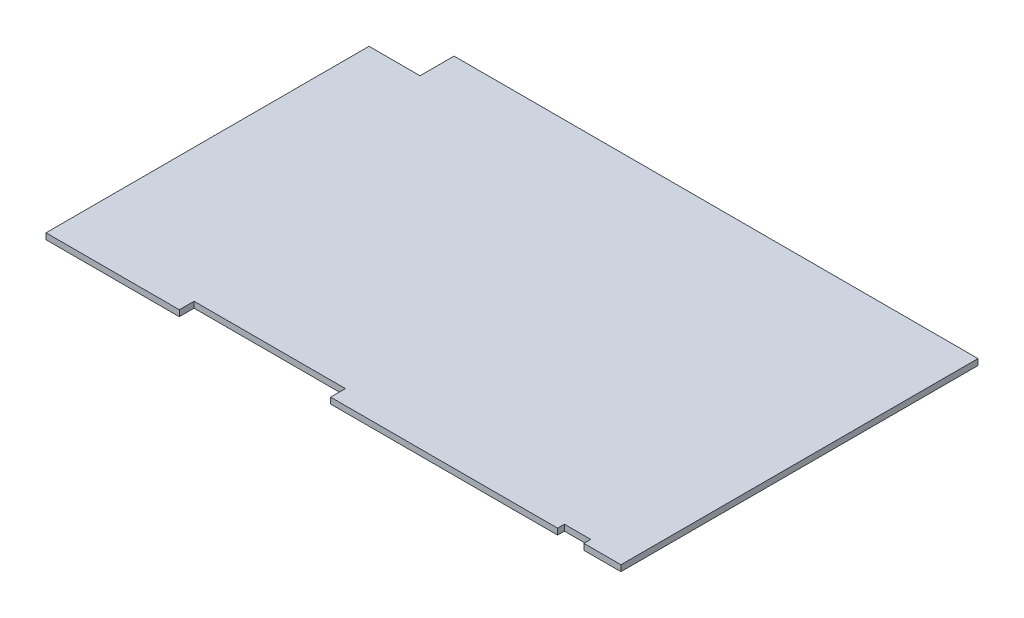
ISO-10303-21;
HEADER;
FILE_DESCRIPTION(('STEP AP214'),'2;1');
FILE_NAME('part.step','',(''),(''),'','','');
FILE_SCHEMA(('AUTOMOTIVE_DESIGN { 1 0 10303 214 1 1 1 1 }'));
ENDSEC;
DATA;
#1=APPLICATION_CONTEXT('core data for automotive mechanical design processes');
#2=APPLICATION_PROTOCOL_DEFINITION('international standard','automotive_design',2000,#1);
#3=PRODUCT_CONTEXT('',#1,'mechanical');
#4=PRODUCT('Part','Part','',(#3));
#5=PRODUCT_RELATED_PRODUCT_CATEGORY('part','',(#4));
#6=PRODUCT_DEFINITION_FORMATION('','',#4);
#7=PRODUCT_DEFINITION_CONTEXT('part definition',#1,'design');
#8=PRODUCT_DEFINITION('design','',#6,#7);
#9=PRODUCT_DEFINITION_SHAPE('','',#8);
#10=(LENGTH_UNIT() NAMED_UNIT(*) SI_UNIT(.MILLI.,.METRE.));
#11=(NAMED_UNIT(*) PLANE_ANGLE_UNIT() SI_UNIT($,.RADIAN.));
#12=(NAMED_UNIT(*) SI_UNIT($,.STERADIAN.) SOLID_ANGLE_UNIT());
#13=UNCERTAINTY_MEASURE_WITH_UNIT(LENGTH_MEASURE(1.E-05),#10,'distance_accuracy_value','');
#14=(GEOMETRIC_REPRESENTATION_CONTEXT(3) GLOBAL_UNCERTAINTY_ASSIGNED_CONTEXT((#13)) GLOBAL_UNIT_ASSIGNED_CONTEXT((#10,
#11,#12)) REPRESENTATION_CONTEXT('',''));
#15=CARTESIAN_POINT('',(0.,0.,0.));
#16=DIRECTION('',(0.,0.,1.));
#17=DIRECTION('',(1.,0.,0.));
#18=AXIS2_PLACEMENT_3D('',#15,#16,#17);
#19=CARTESIAN_POINT('',(-75.9999999996955,1.6,47.19999999981));
#20=DIRECTION('',(0.,0.,-1.));
#21=DIRECTION('',(-1.,0.,0.));
#22=AXIS2_PLACEMENT_3D('',#19,#20,#21);
#23=PLANE('',#22);
#24=DIRECTION('',(1.,0.,0.));
#25=VECTOR('',#24,1.);
#26=CARTESIAN_POINT('',(-75.9999999996955,0.,47.19999999981));
#27=LINE('',#26,#25);
#28=CARTESIAN_POINT('',(-75.9999999996955,0.,47.19999999981));
#29=VERTEX_POINT('',#28);
#30=CARTESIAN_POINT('',(-40.7499992098645,0.,47.19999999981));
#31=VERTEX_POINT('',#30);
#32=EDGE_CURVE('E165',#29,#31,#27,.T.);
#33=ORIENTED_EDGE('',*,*,#32,.T.);
#34=DIRECTION('',(0.,-1.,0.));
#35=VECTOR('',#34,1.);
#36=CARTESIAN_POINT('',(-40.7499992098645,1.6,47.19999999981));
#37=LINE('',#36,#35);
#38=CARTESIAN_POINT('',(-40.7499992098645,1.6,47.19999999981));
#39=VERTEX_POINT('',#38);
#40=EDGE_CURVE('E11',#39,#31,#37,.T.);
#41=ORIENTED_EDGE('',*,*,#40,.F.);
#42=DIRECTION('',(1.,0.,0.));
#43=VECTOR('',#42,1.);
#44=CARTESIAN_POINT('',(-75.9999999996955,1.6,47.19999999981));
#45=LINE('',#44,#43);
#46=CARTESIAN_POINT('',(-75.9999999996955,1.6,47.19999999981));
#47=VERTEX_POINT('',#46);
#48=EDGE_CURVE('E191',#47,#39,#45,.T.);
#49=ORIENTED_EDGE('',*,*,#48,.F.);
#50=DIRECTION('',(0.,-1.,0.));
#51=VECTOR('',#50,1.);
#52=CARTESIAN_POINT('',(-75.9999999996955,1.6,47.19999999981));
#53=LINE('',#52,#51);
#54=EDGE_CURVE('E161',#47,#29,#53,.T.);
#55=ORIENTED_EDGE('',*,*,#54,.T.);
#56=EDGE_LOOP('',(#33,#41,#49,#55));
#57=FACE_BOUND('',#56,.T.);
#58=ADVANCED_FACE('F33',(#57),#23,.F.);
#59=CARTESIAN_POINT('',(-40.7499992098645,1.6,47.19999999981));
#60=DIRECTION('',(-1.,0.,0.));
#61=DIRECTION('',(0.,0.,1.));
#62=AXIS2_PLACEMENT_3D('',#59,#60,#61);
#63=PLANE('',#62);
#64=DIRECTION('',(0.,0.,-1.));
#65=VECTOR('',#64,1.);
#66=CARTESIAN_POINT('',(-40.7499992098645,0.,47.19999999981));
#67=LINE('',#66,#65);
#68=CARTESIAN_POINT('',(-40.7499992098645,0.,43.299999967931));
#69=VERTEX_POINT('',#68);
#70=EDGE_CURVE('E168',#31,#69,#67,.T.);
#71=ORIENTED_EDGE('',*,*,#70,.T.);
#72=DIRECTION('',(0.,-1.,0.));
#73=VECTOR('',#72,1.);
#74=CARTESIAN_POINT('',(-40.7499992098645,1.6,43.299999967931));
#75=LINE('',#74,#73);
#76=CARTESIAN_POINT('',(-40.7499992098645,1.6,43.299999967931));
#77=VERTEX_POINT('',#76);
#78=EDGE_CURVE('E41',#77,#69,#75,.T.);
#79=ORIENTED_EDGE('',*,*,#78,.F.);
#80=DIRECTION('',(0.,0.,-1.));
#81=VECTOR('',#80,1.);
#82=CARTESIAN_POINT('',(-40.7499992098645,1.6,47.19999999981));
#83=LINE('',#82,#81);
#84=EDGE_CURVE('E110',#39,#77,#83,.T.);
#85=ORIENTED_EDGE('',*,*,#84,.F.);
#86=ORIENTED_EDGE('',*,*,#40,.T.);
#87=EDGE_LOOP('',(#71,#79,#85,#86));
#88=FACE_BOUND('',#87,.T.);
#89=ADVANCED_FACE('F279',(#88),#63,.F.);
#90=CARTESIAN_POINT('',(-40.7499992098645,1.6,43.299999967931));
#91=DIRECTION('',(0.,0.,-1.));
#92=DIRECTION('',(-1.,0.,0.));
#93=AXIS2_PLACEMENT_3D('',#90,#91,#92);
#94=PLANE('',#93);
#95=DIRECTION('',(1.,0.,0.));
#96=VECTOR('',#95,1.);
#97=CARTESIAN_POINT('',(-40.7499992098645,0.,43.299999967931));
#98=LINE('',#97,#96);
#99=CARTESIAN_POINT('',(-0.74999920986453,0.,43.299999967931));
#100=VERTEX_POINT('',#99);
#101=EDGE_CURVE('E170',#69,#100,#98,.T.);
#102=ORIENTED_EDGE('',*,*,#101,.T.);
#103=DIRECTION('',(0.,-1.,0.));
#104=VECTOR('',#103,1.);
#105=CARTESIAN_POINT('',(-0.74999920986453,1.6,43.299999967931));
#106=LINE('',#105,#104);
#107=CARTESIAN_POINT('',(-0.74999920986453,1.6,43.299999967931));
#108=VERTEX_POINT('',#107);
#109=EDGE_CURVE('E216',#108,#100,#106,.T.);
#110=ORIENTED_EDGE('',*,*,#109,.F.);
#111=DIRECTION('',(1.,0.,0.));
#112=VECTOR('',#111,1.);
#113=CARTESIAN_POINT('',(-40.7499992098645,1.6,43.299999967931));
#114=LINE('',#113,#112);
#115=EDGE_CURVE('E224',#77,#108,#114,.T.);
#116=ORIENTED_EDGE('',*,*,#115,.F.);
#117=ORIENTED_EDGE('',*,*,#78,.T.);
#118=EDGE_LOOP('',(#102,#110,#116,#117));
#119=FACE_BOUND('',#118,.T.);
#120=ADVANCED_FACE('F222',(#119),#94,.F.);
#121=CARTESIAN_POINT('',(-0.74999920986453,1.6,43.299999967931));
#122=DIRECTION('',(1.,0.,0.));
#123=DIRECTION('',(0.,0.,-1.));
#124=AXIS2_PLACEMENT_3D('',#121,#122,#123);
#125=PLANE('',#124);
#126=DIRECTION('',(0.,0.,1.));
#127=VECTOR('',#126,1.);
#128=CARTESIAN_POINT('',(-0.74999920986453,0.,43.299999967931));
#129=LINE('',#128,#127);
#130=CARTESIAN_POINT('',(-0.749999209864532,0.,47.19999999981));
#131=VERTEX_POINT('',#130);
#132=EDGE_CURVE('E172',#100,#131,#129,.T.);
#133=ORIENTED_EDGE('',*,*,#132,.T.);
#134=DIRECTION('',(0.,-1.,0.));
#135=VECTOR('',#134,1.);
#136=CARTESIAN_POINT('',(-0.749999209864532,1.6,47.19999999981));
#137=LINE('',#136,#135);
#138=CARTESIAN_POINT('',(-0.749999209864532,1.6,47.19999999981));
#139=VERTEX_POINT('',#138);
#140=EDGE_CURVE('E213',#139,#131,#137,.T.);
#141=ORIENTED_EDGE('',*,*,#140,.F.);
#142=DIRECTION('',(0.,0.,1.));
#143=VECTOR('',#142,1.);
#144=CARTESIAN_POINT('',(-0.74999920986453,1.6,43.299999967931));
#145=LINE('',#144,#143);
#146=EDGE_CURVE('E242',#108,#139,#145,.T.);
#147=ORIENTED_EDGE('',*,*,#146,.F.);
#148=ORIENTED_EDGE('',*,*,#109,.T.);
#149=EDGE_LOOP('',(#133,#141,#147,#148));
#150=FACE_BOUND('',#149,.T.);
#151=ADVANCED_FACE('F233',(#150),#125,.F.);
#152=CARTESIAN_POINT('',(-0.749999209864532,1.6,47.19999999981));
#153=DIRECTION('',(0.,0.,-1.));
#154=DIRECTION('',(-1.,0.,0.));
#155=AXIS2_PLACEMENT_3D('',#152,#153,#154);
#156=PLANE('',#155);
#157=DIRECTION('',(1.,0.,0.));
#158=VECTOR('',#157,1.);
#159=CARTESIAN_POINT('',(-0.749999209864532,0.,47.19999999981));
#160=LINE('',#159,#158);
#161=CARTESIAN_POINT('',(59.2500007901355,0.,47.19999999981));
#162=VERTEX_POINT('',#161);
#163=EDGE_CURVE('E174',#131,#162,#160,.T.);
#164=ORIENTED_EDGE('',*,*,#163,.T.);
#165=DIRECTION('',(0.,-1.,0.));
#166=VECTOR('',#165,1.);
#167=CARTESIAN_POINT('',(59.2500007901355,1.6,47.19999999981));
#168=LINE('',#167,#166);
#169=CARTESIAN_POINT('',(59.2500007901355,1.6,47.19999999981));
#170=VERTEX_POINT('',#169);
#171=EDGE_CURVE('E210',#170,#162,#168,.T.);
#172=ORIENTED_EDGE('',*,*,#171,.F.);
#173=DIRECTION('',(1.,0.,0.));
#174=VECTOR('',#173,1.);
#175=CARTESIAN_POINT('',(-0.749999209864532,1.6,47.19999999981));
#176=LINE('',#175,#174);
#177=EDGE_CURVE('E239',#139,#170,#176,.T.);
#178=ORIENTED_EDGE('',*,*,#177,.F.);
#179=ORIENTED_EDGE('',*,*,#140,.T.);
#180=EDGE_LOOP('',(#164,#172,#178,#179));
#181=FACE_BOUND('',#180,.T.);
#182=ADVANCED_FACE('F237',(#181),#156,.F.);
#183=CARTESIAN_POINT('',(59.2500007901355,1.6,47.19999999981));
#184=DIRECTION('',(-1.,0.,0.));
#185=DIRECTION('',(0.,0.,1.));
#186=AXIS2_PLACEMENT_3D('',#183,#184,#185);
#187=PLANE('',#186);
#188=DIRECTION('',(0.,0.,-1.));
#189=VECTOR('',#188,1.);
#190=CARTESIAN_POINT('',(59.2500007901355,0.,47.19999999981));
#191=LINE('',#190,#189);
#192=CARTESIAN_POINT('',(59.2500007901355,0.,45.38999999981));
#193=VERTEX_POINT('',#192);
#194=EDGE_CURVE('E176',#162,#193,#191,.T.);
#195=ORIENTED_EDGE('',*,*,#194,.T.);
#196=DIRECTION('',(0.,-1.,0.));
#197=VECTOR('',#196,1.);
#198=CARTESIAN_POINT('',(59.2500007901355,1.6,45.38999999981));
#199=LINE('',#198,#197);
#200=CARTESIAN_POINT('',(59.2500007901355,1.6,45.38999999981));
#201=VERTEX_POINT('',#200);
#202=EDGE_CURVE('E207',#201,#193,#199,.T.);
#203=ORIENTED_EDGE('',*,*,#202,.F.);
#204=DIRECTION('',(0.,0.,-1.));
#205=VECTOR('',#204,1.);
#206=CARTESIAN_POINT('',(59.2500007901355,1.6,47.19999999981));
#207=LINE('',#206,#205);
#208=EDGE_CURVE('E241',#170,#201,#207,.T.);
#209=ORIENTED_EDGE('',*,*,#208,.F.);
#210=ORIENTED_EDGE('',*,*,#171,.T.);
#211=EDGE_LOOP('',(#195,#203,#209,#210));
#212=FACE_BOUND('',#211,.T.);
#213=ADVANCED_FACE('F292',(#212),#187,.F.);
#214=CARTESIAN_POINT('',(59.2500007901355,1.6,45.38999999981));
#215=DIRECTION('',(0.,0.,-1.));
#216=DIRECTION('',(-1.,0.,0.));
#217=AXIS2_PLACEMENT_3D('',#214,#215,#216);
#218=PLANE('',#217);
#219=DIRECTION('',(1.,0.,0.));
#220=VECTOR('',#219,1.);
#221=CARTESIAN_POINT('',(59.2500007901355,0.,45.38999999981));
#222=LINE('',#221,#220);
#223=CARTESIAN_POINT('',(66.1950000003045,0.,45.38999999981));
#224=VERTEX_POINT('',#223);
#225=EDGE_CURVE('E178',#193,#224,#222,.T.);
#226=ORIENTED_EDGE('',*,*,#225,.T.);
#227=DIRECTION('',(0.,-1.,0.));
#228=VECTOR('',#227,1.);
#229=CARTESIAN_POINT('',(66.1950000003045,1.6,45.38999999981));
#230=LINE('',#229,#228);
#231=CARTESIAN_POINT('',(66.1950000003045,1.6,45.38999999981));
#232=VERTEX_POINT('',#231);
#233=EDGE_CURVE('E204',#232,#224,#230,.T.);
#234=ORIENTED_EDGE('',*,*,#233,.F.);
#235=DIRECTION('',(1.,0.,0.));
#236=VECTOR('',#235,1.);
#237=CARTESIAN_POINT('',(59.2500007901355,1.6,45.38999999981));
#238=LINE('',#237,#236);
#239=EDGE_CURVE('E244',#201,#232,#238,.T.);
#240=ORIENTED_EDGE('',*,*,#239,.F.);
#241=ORIENTED_EDGE('',*,*,#202,.T.);
#242=EDGE_LOOP('',(#226,#234,#240,#241));
#243=FACE_BOUND('',#242,.T.);
#244=ADVANCED_FACE('F295',(#243),#218,.F.);
#245=CARTESIAN_POINT('',(66.1950000003045,1.6,45.38999999981));
#246=DIRECTION('',(1.,0.,0.));
#247=DIRECTION('',(0.,0.,-1.));
#248=AXIS2_PLACEMENT_3D('',#245,#246,#247);
#249=PLANE('',#248);
#250=DIRECTION('',(0.,0.,1.));
#251=VECTOR('',#250,1.);
#252=CARTESIAN_POINT('',(66.1950000003045,0.,45.38999999981));
#253=LINE('',#252,#251);
#254=CARTESIAN_POINT('',(66.1950000003045,0.,47.19999999981));
#255=VERTEX_POINT('',#254);
#256=EDGE_CURVE('E180',#224,#255,#253,.T.);
#257=ORIENTED_EDGE('',*,*,#256,.T.);
#258=DIRECTION('',(0.,-1.,0.));
#259=VECTOR('',#258,1.);
#260=CARTESIAN_POINT('',(66.1950000003045,1.6,47.19999999981));
#261=LINE('',#260,#259);
#262=CARTESIAN_POINT('',(66.1950000003045,1.6,47.19999999981));
#263=VERTEX_POINT('',#262);
#264=EDGE_CURVE('E201',#263,#255,#261,.T.);
#265=ORIENTED_EDGE('',*,*,#264,.F.);
#266=DIRECTION('',(0.,0.,1.));
#267=VECTOR('',#266,1.);
#268=CARTESIAN_POINT('',(66.1950000003045,1.6,45.38999999981));
#269=LINE('',#268,#267);
#270=EDGE_CURVE('E250',#232,#263,#269,.T.);
#271=ORIENTED_EDGE('',*,*,#270,.F.);
#272=ORIENTED_EDGE('',*,*,#233,.T.);
#273=EDGE_LOOP('',(#257,#265,#271,#272));
#274=FACE_BOUND('',#273,.T.);
#275=ADVANCED_FACE('F299',(#274),#249,.F.);
#276=CARTESIAN_POINT('',(66.1950000003045,1.6,47.19999999981));
#277=DIRECTION('',(0.,0.,-1.));
#278=DIRECTION('',(-1.,0.,0.));
#279=AXIS2_PLACEMENT_3D('',#276,#277,#278);
#280=PLANE('',#279);
#281=DIRECTION('',(1.,0.,0.));
#282=VECTOR('',#281,1.);
#283=CARTESIAN_POINT('',(66.1950000003045,0.,47.19999999981));
#284=LINE('',#283,#282);
#285=CARTESIAN_POINT('',(75.9999999996955,0.,47.19999999981));
#286=VERTEX_POINT('',#285);
#287=EDGE_CURVE('E182',#255,#286,#284,.T.);
#288=ORIENTED_EDGE('',*,*,#287,.T.);
#289=DIRECTION('',(0.,-1.,0.));
#290=VECTOR('',#289,1.);
#291=CARTESIAN_POINT('',(75.9999999996955,1.6,47.19999999981));
#292=LINE('',#291,#290);
#293=CARTESIAN_POINT('',(75.9999999996955,1.6,47.19999999981));
#294=VERTEX_POINT('',#293);
#295=EDGE_CURVE('E198',#294,#286,#292,.T.);
#296=ORIENTED_EDGE('',*,*,#295,.F.);
#297=DIRECTION('',(1.,0.,0.));
#298=VECTOR('',#297,1.);
#299=CARTESIAN_POINT('',(66.1950000003045,1.6,47.19999999981));
#300=LINE('',#299,#298);
#301=EDGE_CURVE('E252',#263,#294,#300,.T.);
#302=ORIENTED_EDGE('',*,*,#301,.F.);
#303=ORIENTED_EDGE('',*,*,#264,.T.);
#304=EDGE_LOOP('',(#288,#296,#302,#303));
#305=FACE_BOUND('',#304,.T.);
#306=ADVANCED_FACE('F303',(#305),#280,.F.);
#307=CARTESIAN_POINT('',(75.9999999996955,1.6,47.19999999981));
#308=DIRECTION('',(-1.,0.,0.));
#309=DIRECTION('',(0.,0.,1.));
#310=AXIS2_PLACEMENT_3D('',#307,#308,#309);
#311=PLANE('',#310);
#312=DIRECTION('',(0.,0.,-1.));
#313=VECTOR('',#312,1.);
#314=CARTESIAN_POINT('',(75.9999999996955,0.,47.19999999981));
#315=LINE('',#314,#313);
#316=CARTESIAN_POINT('',(75.9999999996955,0.,-47.19999999981));
#317=VERTEX_POINT('',#316);
#318=EDGE_CURVE('E184',#286,#317,#315,.T.);
#319=ORIENTED_EDGE('',*,*,#318,.T.);
#320=DIRECTION('',(0.,-1.,0.));
#321=VECTOR('',#320,1.);
#322=CARTESIAN_POINT('',(75.9999999996955,1.6,-47.19999999981));
#323=LINE('',#322,#321);
#324=CARTESIAN_POINT('',(75.9999999996955,1.6,-47.19999999981));
#325=VERTEX_POINT('',#324);
#326=EDGE_CURVE('E195',#325,#317,#323,.T.);
#327=ORIENTED_EDGE('',*,*,#326,.F.);
#328=DIRECTION('',(0.,0.,-1.));
#329=VECTOR('',#328,1.);
#330=CARTESIAN_POINT('',(75.9999999996955,1.6,47.19999999981));
#331=LINE('',#330,#329);
#332=EDGE_CURVE('E254',#294,#325,#331,.T.);
#333=ORIENTED_EDGE('',*,*,#332,.F.);
#334=ORIENTED_EDGE('',*,*,#295,.T.);
#335=EDGE_LOOP('',(#319,#327,#333,#334));
#336=FACE_BOUND('',#335,.T.);
#337=ADVANCED_FACE('F260',(#336),#311,.F.);
#338=CARTESIAN_POINT('',(75.9999999996955,1.6,-47.19999999981));
#339=DIRECTION('',(0.,0.,1.));
#340=DIRECTION('',(1.,0.,0.));
#341=AXIS2_PLACEMENT_3D('',#338,#339,#340);
#342=PLANE('',#341);
#343=DIRECTION('',(-1.,0.,0.));
#344=VECTOR('',#343,1.);
#345=CARTESIAN_POINT('',(75.9999999996955,0.,-47.19999999981));
#346=LINE('',#345,#344);
#347=CARTESIAN_POINT('',(-62.5173044860735,0.,-47.19999999981));
#348=VERTEX_POINT('',#347);
#349=EDGE_CURVE('E186',#317,#348,#346,.T.);
#350=ORIENTED_EDGE('',*,*,#349,.T.);
#351=DIRECTION('',(0.,-1.,0.));
#352=VECTOR('',#351,1.);
#353=CARTESIAN_POINT('',(-62.5173044860735,1.6,-47.19999999981));
#354=LINE('',#353,#352);
#355=CARTESIAN_POINT('',(-62.5173044860735,1.6,-47.19999999981));
#356=VERTEX_POINT('',#355);
#357=EDGE_CURVE('E156',#356,#348,#354,.T.);
#358=ORIENTED_EDGE('',*,*,#357,.F.);
#359=DIRECTION('',(-1.,0.,0.));
#360=VECTOR('',#359,1.);
#361=CARTESIAN_POINT('',(75.9999999996955,1.6,-47.19999999981));
#362=LINE('',#361,#360);
#363=EDGE_CURVE('E147',#325,#356,#362,.T.);
#364=ORIENTED_EDGE('',*,*,#363,.F.);
#365=ORIENTED_EDGE('',*,*,#326,.T.);
#366=EDGE_LOOP('',(#350,#358,#364,#365));
#367=FACE_BOUND('',#366,.T.);
#368=ADVANCED_FACE('F264',(#367),#342,.F.);
#369=CARTESIAN_POINT('',(-62.5173044860735,1.6,-47.19999999981));
#370=DIRECTION('',(1.,0.,0.));
#371=DIRECTION('',(0.,0.,-1.));
#372=AXIS2_PLACEMENT_3D('',#369,#370,#371);
#373=PLANE('',#372);
#374=DIRECTION('',(0.,0.,1.));
#375=VECTOR('',#374,1.);
#376=CARTESIAN_POINT('',(-62.5173044860735,0.,-47.19999999981));
#377=LINE('',#376,#375);
#378=CARTESIAN_POINT('',(-62.5173044860735,0.,-38.19999999981));
#379=VERTEX_POINT('',#378);
#380=EDGE_CURVE('E155',#348,#379,#377,.T.);
#381=ORIENTED_EDGE('',*,*,#380,.T.);
#382=DIRECTION('',(0.,-1.,0.));
#383=VECTOR('',#382,1.);
#384=CARTESIAN_POINT('',(-62.5173044860735,1.6,-38.19999999981));
#385=LINE('',#384,#383);
#386=CARTESIAN_POINT('',(-62.5173044860735,1.6,-38.19999999981));
#387=VERTEX_POINT('',#386);
#388=EDGE_CURVE('E152',#387,#379,#385,.T.);
#389=ORIENTED_EDGE('',*,*,#388,.F.);
#390=DIRECTION('',(0.,0.,1.));
#391=VECTOR('',#390,1.);
#392=CARTESIAN_POINT('',(-62.5173044860735,1.6,-47.19999999981));
#393=LINE('',#392,#391);
#394=EDGE_CURVE('E141',#356,#387,#393,.T.);
#395=ORIENTED_EDGE('',*,*,#394,.F.);
#396=ORIENTED_EDGE('',*,*,#357,.T.);
#397=EDGE_LOOP('',(#381,#389,#395,#396));
#398=FACE_BOUND('',#397,.T.);
#399=ADVANCED_FACE('F153',(#398),#373,.F.);
#400=CARTESIAN_POINT('',(-62.5173044860735,1.6,-38.19999999981));
#401=DIRECTION('',(0.,0.,1.));
#402=DIRECTION('',(1.,0.,0.));
#403=AXIS2_PLACEMENT_3D('',#400,#401,#402);
#404=PLANE('',#403);
#405=DIRECTION('',(-1.,0.,0.));
#406=VECTOR('',#405,1.);
#407=CARTESIAN_POINT('',(-62.5173044860735,0.,-38.19999999981));
#408=LINE('',#407,#406);
#409=CARTESIAN_POINT('',(-75.9999999996955,0.,-38.19999999981));
#410=VERTEX_POINT('',#409);
#411=EDGE_CURVE('E96',#379,#410,#408,.T.);
#412=ORIENTED_EDGE('',*,*,#411,.T.);
#413=DIRECTION('',(0.,-1.,0.));
#414=VECTOR('',#413,1.);
#415=CARTESIAN_POINT('',(-75.9999999996955,1.6,-38.19999999981));
#416=LINE('',#415,#414);
#417=CARTESIAN_POINT('',(-75.9999999996955,1.6,-38.19999999981));
#418=VERTEX_POINT('',#417);
#419=EDGE_CURVE('E157',#418,#410,#416,.T.);
#420=ORIENTED_EDGE('',*,*,#419,.F.);
#421=DIRECTION('',(-1.,0.,0.));
#422=VECTOR('',#421,1.);
#423=CARTESIAN_POINT('',(-62.5173044860735,1.6,-38.19999999981));
#424=LINE('',#423,#422);
#425=EDGE_CURVE('E145',#387,#418,#424,.T.);
#426=ORIENTED_EDGE('',*,*,#425,.F.);
#427=ORIENTED_EDGE('',*,*,#388,.T.);
#428=EDGE_LOOP('',(#412,#420,#426,#427));
#429=FACE_BOUND('',#428,.T.);
#430=ADVANCED_FACE('F159',(#429),#404,.F.);
#431=CARTESIAN_POINT('',(-75.9999999996955,1.6,-38.19999999981));
#432=DIRECTION('',(1.,0.,0.));
#433=DIRECTION('',(0.,0.,-1.));
#434=AXIS2_PLACEMENT_3D('',#431,#432,#433);
#435=PLANE('',#434);
#436=DIRECTION('',(0.,0.,1.));
#437=VECTOR('',#436,1.);
#438=CARTESIAN_POINT('',(-75.9999999996955,0.,-38.19999999981));
#439=LINE('',#438,#437);
#440=EDGE_CURVE('E102',#410,#29,#439,.T.);
#441=ORIENTED_EDGE('',*,*,#440,.T.);
#442=ORIENTED_EDGE('',*,*,#54,.F.);
#443=DIRECTION('',(0.,0.,1.));
#444=VECTOR('',#443,1.);
#445=CARTESIAN_POINT('',(-75.9999999996955,1.6,-38.19999999981));
#446=LINE('',#445,#444);
#447=EDGE_CURVE('E49',#418,#47,#446,.T.);
#448=ORIENTED_EDGE('',*,*,#447,.F.);
#449=ORIENTED_EDGE('',*,*,#419,.T.);
#450=EDGE_LOOP('',(#441,#442,#448,#449));
#451=FACE_BOUND('',#450,.T.);
#452=ADVANCED_FACE('F268',(#451),#435,.F.);
#453=CARTESIAN_POINT('',(0.,1.6,0.));
#454=DIRECTION('',(0.,1.,0.));
#455=DIRECTION('',(0.,0.,1.));
#456=AXIS2_PLACEMENT_3D('',#453,#454,#455);
#457=PLANE('',#456);
#458=ORIENTED_EDGE('',*,*,#48,.T.);
#459=ORIENTED_EDGE('',*,*,#84,.T.);
#460=ORIENTED_EDGE('',*,*,#115,.T.);
#461=ORIENTED_EDGE('',*,*,#146,.T.);
#462=ORIENTED_EDGE('',*,*,#177,.T.);
#463=ORIENTED_EDGE('',*,*,#208,.T.);
#464=ORIENTED_EDGE('',*,*,#239,.T.);
#465=ORIENTED_EDGE('',*,*,#270,.T.);
#466=ORIENTED_EDGE('',*,*,#301,.T.);
#467=ORIENTED_EDGE('',*,*,#332,.T.);
#468=ORIENTED_EDGE('',*,*,#363,.T.);
#469=ORIENTED_EDGE('',*,*,#394,.T.);
#470=ORIENTED_EDGE('',*,*,#425,.T.);
#471=ORIENTED_EDGE('',*,*,#447,.T.);
#472=EDGE_LOOP('',(#458,#459,#460,#461,#462,#463,#464,#465,#466,#467,#468,#469,#470,#471));
#473=FACE_BOUND('',#472,.T.);
#474=ADVANCED_FACE('F143',(#473),#457,.T.);
#475=CARTESIAN_POINT('',(0.,0.,0.));
#476=DIRECTION('',(0.,1.,0.));
#477=DIRECTION('',(0.,0.,1.));
#478=AXIS2_PLACEMENT_3D('',#475,#476,#477);
#479=PLANE('',#478);
#480=ORIENTED_EDGE('',*,*,#32,.F.);
#481=ORIENTED_EDGE('',*,*,#440,.F.);
#482=ORIENTED_EDGE('',*,*,#411,.F.);
#483=ORIENTED_EDGE('',*,*,#380,.F.);
#484=ORIENTED_EDGE('',*,*,#349,.F.);
#485=ORIENTED_EDGE('',*,*,#318,.F.);
#486=ORIENTED_EDGE('',*,*,#287,.F.);
#487=ORIENTED_EDGE('',*,*,#256,.F.);
#488=ORIENTED_EDGE('',*,*,#225,.F.);
#489=ORIENTED_EDGE('',*,*,#194,.F.);
#490=ORIENTED_EDGE('',*,*,#163,.F.);
#491=ORIENTED_EDGE('',*,*,#132,.F.);
#492=ORIENTED_EDGE('',*,*,#101,.F.);
#493=ORIENTED_EDGE('',*,*,#70,.F.);
#494=EDGE_LOOP('',(#480,#481,#482,#483,#484,#485,#486,#487,#488,#489,#490,#491,#492,#493));
#495=FACE_BOUND('',#494,.T.);
#496=ADVANCED_FACE('F228',(#495),#479,.F.);
#497=CLOSED_SHELL('',(#58,#89,#120,#151,#182,#213,#244,#275,#306,#337,#368,#399,#430,#452,#474,#496));
#498=MANIFOLD_SOLID_BREP('B2',#497);
#499=ADVANCED_BREP_SHAPE_REPRESENTATION('',(#18,#498),#14);
#500=SHAPE_DEFINITION_REPRESENTATION(#9,#499);
ENDSEC;
END-ISO-10303-21;
